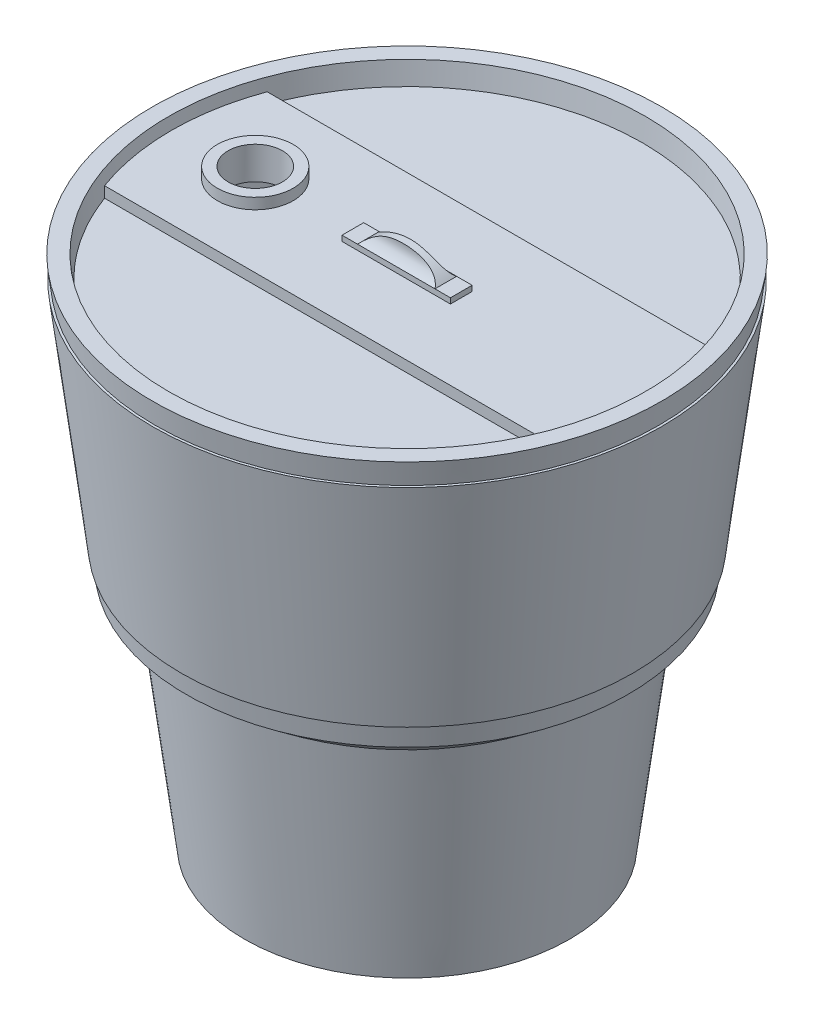
ISO-10303-21;
HEADER;
FILE_DESCRIPTION(('STEP AP214'),'2;1');
FILE_NAME('part.step','',(''),(''),'','','');
FILE_SCHEMA(('AUTOMOTIVE_DESIGN { 1 0 10303 214 1 1 1 1 }'));
ENDSEC;
DATA;
#1=APPLICATION_CONTEXT('core data for automotive mechanical design processes');
#2=APPLICATION_PROTOCOL_DEFINITION('international standard','automotive_design',2000,#1);
#3=PRODUCT_CONTEXT('',#1,'mechanical');
#4=PRODUCT('Part','Part','',(#3));
#5=PRODUCT_RELATED_PRODUCT_CATEGORY('part','',(#4));
#6=PRODUCT_DEFINITION_FORMATION('','',#4);
#7=PRODUCT_DEFINITION_CONTEXT('part definition',#1,'design');
#8=PRODUCT_DEFINITION('design','',#6,#7);
#9=PRODUCT_DEFINITION_SHAPE('','',#8);
#10=(LENGTH_UNIT() NAMED_UNIT(*) SI_UNIT(.MILLI.,.METRE.));
#11=(NAMED_UNIT(*) PLANE_ANGLE_UNIT() SI_UNIT($,.RADIAN.));
#12=(NAMED_UNIT(*) SI_UNIT($,.STERADIAN.) SOLID_ANGLE_UNIT());
#13=UNCERTAINTY_MEASURE_WITH_UNIT(LENGTH_MEASURE(1.E-05),#10,'distance_accuracy_value','');
#14=(GEOMETRIC_REPRESENTATION_CONTEXT(3) GLOBAL_UNCERTAINTY_ASSIGNED_CONTEXT((#13)) GLOBAL_UNIT_ASSIGNED_CONTEXT((#10,
#11,#12)) REPRESENTATION_CONTEXT('',''));
#15=CARTESIAN_POINT('',(0.,0.,0.));
#16=DIRECTION('',(0.,0.,1.));
#17=DIRECTION('',(1.,0.,0.));
#18=AXIS2_PLACEMENT_3D('',#15,#16,#17);
#19=CARTESIAN_POINT('',(0.,46.2361111111111,0.));
#20=DIRECTION('',(0.,1.,0.));
#21=DIRECTION('',(0.,0.,1.));
#22=AXIS2_PLACEMENT_3D('',#19,#20,#21);
#23=PLANE('',#22);
#24=CARTESIAN_POINT('',(-14.,46.2361111111111,0.));
#25=DIRECTION('',(0.,1.,0.));
#26=DIRECTION('',(0.,0.,1.));
#27=AXIS2_PLACEMENT_3D('',#24,#25,#26);
#28=CIRCLE('',#27,3.5);
#29=CARTESIAN_POINT('',(-14.,46.2361111111111,3.5));
#30=VERTEX_POINT('',#29);
#31=EDGE_CURVE('E194',#30,#30,#28,.T.);
#32=ORIENTED_EDGE('',*,*,#31,.F.);
#33=EDGE_LOOP('',(#32));
#34=FACE_BOUND('',#33,.T.);
#35=CARTESIAN_POINT('',(0.,46.2361111111111,0.));
#36=DIRECTION('',(0.,1.,0.));
#37=DIRECTION('',(0.,0.,1.));
#38=AXIS2_PLACEMENT_3D('',#35,#36,#37);
#39=CIRCLE('',#38,21.738326672194);
#40=CARTESIAN_POINT('',(-20.403549850627,46.2361111111111,-7.5));
#41=VERTEX_POINT('',#40);
#42=CARTESIAN_POINT('',(-20.403549850627,46.2361111111111,7.5));
#43=VERTEX_POINT('',#42);
#44=EDGE_CURVE('E203',#41,#43,#39,.T.);
#45=ORIENTED_EDGE('',*,*,#44,.T.);
#46=DIRECTION('',(1.,0.,0.));
#47=VECTOR('',#46,1.);
#48=CARTESIAN_POINT('',(20.403549850627,46.2361111111111,7.5));
#49=LINE('',#48,#47);
#50=CARTESIAN_POINT('',(20.403549850627,46.2361111111111,7.5));
#51=VERTEX_POINT('',#50);
#52=EDGE_CURVE('E207',#43,#51,#49,.T.);
#53=ORIENTED_EDGE('',*,*,#52,.T.);
#54=CARTESIAN_POINT('',(0.,46.2361111111111,0.));
#55=DIRECTION('',(0.,1.,0.));
#56=DIRECTION('',(0.,0.,1.));
#57=AXIS2_PLACEMENT_3D('',#54,#55,#56);
#58=CIRCLE('',#57,21.738326672194);
#59=CARTESIAN_POINT('',(20.403549850627,46.2361111111111,-7.5));
#60=VERTEX_POINT('',#59);
#61=EDGE_CURVE('E211',#51,#60,#58,.T.);
#62=ORIENTED_EDGE('',*,*,#61,.T.);
#63=DIRECTION('',(-1.,0.,0.));
#64=VECTOR('',#63,1.);
#65=CARTESIAN_POINT('',(20.403549850627,46.2361111111111,-7.5));
#66=LINE('',#65,#64);
#67=EDGE_CURVE('E214',#60,#41,#66,.T.);
#68=ORIENTED_EDGE('',*,*,#67,.T.);
#69=EDGE_LOOP('',(#45,#53,#62,#68));
#70=FACE_BOUND('',#69,.T.);
#71=DIRECTION('',(0.,0.,-1.));
#72=VECTOR('',#71,1.);
#73=CARTESIAN_POINT('',(5.,46.2361111111111,1.));
#74=LINE('',#73,#72);
#75=CARTESIAN_POINT('',(5.,46.2361111111111,1.));
#76=VERTEX_POINT('',#75);
#77=CARTESIAN_POINT('',(5.,46.2361111111111,-1.));
#78=VERTEX_POINT('',#77);
#79=EDGE_CURVE('E65',#76,#78,#74,.T.);
#80=ORIENTED_EDGE('',*,*,#79,.F.);
#81=DIRECTION('',(1.,0.,0.));
#82=VECTOR('',#81,1.);
#83=CARTESIAN_POINT('',(-5.,46.2361111111111,1.));
#84=LINE('',#83,#82);
#85=CARTESIAN_POINT('',(-5.,46.2361111111111,1.));
#86=VERTEX_POINT('',#85);
#87=EDGE_CURVE('E70',#86,#76,#84,.T.);
#88=ORIENTED_EDGE('',*,*,#87,.F.);
#89=DIRECTION('',(0.,0.,-1.));
#90=VECTOR('',#89,1.);
#91=CARTESIAN_POINT('',(-5.,46.2361111111111,1.));
#92=LINE('',#91,#90);
#93=CARTESIAN_POINT('',(-5.,46.2361111111111,-1.));
#94=VERTEX_POINT('',#93);
#95=EDGE_CURVE('E172',#86,#94,#92,.T.);
#96=ORIENTED_EDGE('',*,*,#95,.T.);
#97=DIRECTION('',(1.,0.,0.));
#98=VECTOR('',#97,1.);
#99=CARTESIAN_POINT('',(-5.,46.2361111111111,-1.));
#100=LINE('',#99,#98);
#101=EDGE_CURVE('E361',#94,#78,#100,.T.);
#102=ORIENTED_EDGE('',*,*,#101,.T.);
#103=EDGE_LOOP('',(#80,#88,#96,#102));
#104=FACE_BOUND('',#103,.T.);
#105=ADVANCED_FACE('F49',(#34,#70,#104),#23,.T.);
#106=CARTESIAN_POINT('',(0.,45.2361111111111,0.));
#107=DIRECTION('',(0.,1.,0.));
#108=DIRECTION('',(0.,0.,1.));
#109=AXIS2_PLACEMENT_3D('',#106,#107,#108);
#110=PLANE('',#109);
#111=DIRECTION('',(-1.,0.,0.));
#112=VECTOR('',#111,1.);
#113=CARTESIAN_POINT('',(20.403549850627,45.2361111111111,-7.5));
#114=LINE('',#113,#112);
#115=CARTESIAN_POINT('',(20.403549850627,45.2361111111111,-7.5));
#116=VERTEX_POINT('',#115);
#117=CARTESIAN_POINT('',(-20.403549850627,45.2361111111111,-7.5));
#118=VERTEX_POINT('',#117);
#119=EDGE_CURVE('E208',#116,#118,#114,.T.);
#120=ORIENTED_EDGE('',*,*,#119,.F.);
#121=CARTESIAN_POINT('',(0.,45.2361111111111,0.));
#122=DIRECTION('',(0.,-1.,0.));
#123=DIRECTION('',(0.,0.,-1.));
#124=AXIS2_PLACEMENT_3D('',#121,#122,#123);
#125=CIRCLE('',#124,21.738326672194);
#126=EDGE_CURVE('E243',#118,#116,#125,.T.);
#127=ORIENTED_EDGE('',*,*,#126,.F.);
#128=EDGE_LOOP('',(#120,#127));
#129=FACE_BOUND('',#128,.T.);
#130=ADVANCED_FACE('F256',(#129),#110,.T.);
#131=CARTESIAN_POINT('',(0.,44.2361111111111,0.));
#132=DIRECTION('',(0.,1.,0.));
#133=DIRECTION('',(0.,0.,1.));
#134=AXIS2_PLACEMENT_3D('',#131,#132,#133);
#135=CONICAL_SURFACE('',#134,21.613326672194,0.124354994546761);
#136=CARTESIAN_POINT('',(20.403549850627,45.2361111111111,7.5));
#137=VERTEX_POINT('',#136);
#138=EDGE_CURVE('E244',#116,#137,#125,.T.);
#139=ORIENTED_EDGE('',*,*,#138,.T.);
#140=CARTESIAN_POINT('',(-20.403549850627,45.2361111111111,7.5));
#141=VERTEX_POINT('',#140);
#142=EDGE_CURVE('E247',#137,#141,#125,.T.);
#143=ORIENTED_EDGE('',*,*,#142,.T.);
#144=CARTESIAN_POINT('',(0.,45.2361111111111,0.));
#145=DIRECTION('',(0.,1.,0.));
#146=DIRECTION('',(0.,0.,1.));
#147=AXIS2_PLACEMENT_3D('',#144,#145,#146);
#148=CIRCLE('',#147,21.738326672194);
#149=EDGE_CURVE('E199',#118,#141,#148,.T.);
#150=ORIENTED_EDGE('',*,*,#149,.F.);
#151=ORIENTED_EDGE('',*,*,#126,.T.);
#152=EDGE_LOOP('',(#139,#143,#150,#151));
#153=FACE_BOUND('',#152,.T.);
#154=CARTESIAN_POINT('',(0.,44.2361111111111,0.));
#155=DIRECTION('',(0.,-1.,0.));
#156=DIRECTION('',(0.,0.,-1.));
#157=AXIS2_PLACEMENT_3D('',#154,#155,#156);
#158=CIRCLE('',#157,21.613326672194);
#159=CARTESIAN_POINT('',(0.,44.2361111111111,-21.613326672194));
#160=VERTEX_POINT('',#159);
#161=EDGE_CURVE('E133',#160,#160,#158,.T.);
#162=ORIENTED_EDGE('',*,*,#161,.F.);
#163=EDGE_LOOP('',(#162));
#164=FACE_BOUND('',#163,.T.);
#165=ADVANCED_FACE('F51',(#153,#164),#135,.T.);
#166=CARTESIAN_POINT('',(21.613326672194,44.2361111111111,0.));
#167=DIRECTION('',(0.,-1.,0.));
#168=DIRECTION('',(0.,0.,-1.));
#169=AXIS2_PLACEMENT_3D('',#166,#167,#168);
#170=PLANE('',#169);
#171=CARTESIAN_POINT('',(-14.,44.2361111111111,0.));
#172=DIRECTION('',(0.,-1.,0.));
#173=DIRECTION('',(0.,0.,-1.));
#174=AXIS2_PLACEMENT_3D('',#171,#172,#173);
#175=CIRCLE('',#174,2.5);
#176=CARTESIAN_POINT('',(-14.,44.2361111111111,-2.5));
#177=VERTEX_POINT('',#176);
#178=EDGE_CURVE('E190',#177,#177,#175,.T.);
#179=ORIENTED_EDGE('',*,*,#178,.F.);
#180=EDGE_LOOP('',(#179));
#181=FACE_BOUND('',#180,.T.);
#182=ORIENTED_EDGE('',*,*,#161,.T.);
#183=EDGE_LOOP('',(#182));
#184=FACE_BOUND('',#183,.T.);
#185=ADVANCED_FACE('F253',(#181,#184),#170,.T.);
#186=DIRECTION('',(1.,0.,0.));
#187=VECTOR('',#186,1.);
#188=CARTESIAN_POINT('',(20.403549850627,45.2361111111111,7.5));
#189=LINE('',#188,#187);
#190=EDGE_CURVE('E221',#141,#137,#189,.T.);
#191=ORIENTED_EDGE('',*,*,#190,.F.);
#192=ORIENTED_EDGE('',*,*,#142,.F.);
#193=EDGE_LOOP('',(#191,#192));
#194=FACE_BOUND('',#193,.T.);
#195=ADVANCED_FACE('F262',(#194),#110,.T.);
#196=CARTESIAN_POINT('',(0.,46.2361111111111,0.));
#197=DIRECTION('',(0.,-1.,0.));
#198=DIRECTION('',(0.,0.,-1.));
#199=AXIS2_PLACEMENT_3D('',#196,#197,#198);
#200=CYLINDRICAL_SURFACE('',#199,21.738326672194);
#201=ORIENTED_EDGE('',*,*,#149,.T.);
#202=DIRECTION('',(0.,-1.,0.));
#203=VECTOR('',#202,1.);
#204=CARTESIAN_POINT('',(-20.403549850627,46.2361111111111,7.5));
#205=LINE('',#204,#203);
#206=EDGE_CURVE('E239',#43,#141,#205,.T.);
#207=ORIENTED_EDGE('',*,*,#206,.F.);
#208=ORIENTED_EDGE('',*,*,#44,.F.);
#209=DIRECTION('',(0.,-1.,0.));
#210=VECTOR('',#209,1.);
#211=CARTESIAN_POINT('',(-20.403549850627,46.2361111111111,-7.5));
#212=LINE('',#211,#210);
#213=EDGE_CURVE('E217',#41,#118,#212,.T.);
#214=ORIENTED_EDGE('',*,*,#213,.T.);
#215=EDGE_LOOP('',(#201,#207,#208,#214));
#216=FACE_BOUND('',#215,.T.);
#217=ADVANCED_FACE('F288',(#216),#200,.T.);
#218=CARTESIAN_POINT('',(20.403549850627,46.2361111111111,7.5));
#219=DIRECTION('',(0.,0.,-1.));
#220=DIRECTION('',(-1.,0.,0.));
#221=AXIS2_PLACEMENT_3D('',#218,#219,#220);
#222=PLANE('',#221);
#223=ORIENTED_EDGE('',*,*,#190,.T.);
#224=DIRECTION('',(0.,-1.,0.));
#225=VECTOR('',#224,1.);
#226=CARTESIAN_POINT('',(20.403549850627,46.2361111111111,7.5));
#227=LINE('',#226,#225);
#228=EDGE_CURVE('E235',#51,#137,#227,.T.);
#229=ORIENTED_EDGE('',*,*,#228,.F.);
#230=ORIENTED_EDGE('',*,*,#52,.F.);
#231=ORIENTED_EDGE('',*,*,#206,.T.);
#232=EDGE_LOOP('',(#223,#229,#230,#231));
#233=FACE_BOUND('',#232,.T.);
#234=ADVANCED_FACE('F284',(#233),#222,.F.);
#235=CARTESIAN_POINT('',(0.,46.2361111111111,0.));
#236=DIRECTION('',(0.,-1.,0.));
#237=DIRECTION('',(0.,0.,-1.));
#238=AXIS2_PLACEMENT_3D('',#235,#236,#237);
#239=CYLINDRICAL_SURFACE('',#238,21.738326672194);
#240=ORIENTED_EDGE('',*,*,#138,.F.);
#241=DIRECTION('',(0.,-1.,0.));
#242=VECTOR('',#241,1.);
#243=CARTESIAN_POINT('',(20.403549850627,46.2361111111111,-7.5));
#244=LINE('',#243,#242);
#245=EDGE_CURVE('E231',#60,#116,#244,.T.);
#246=ORIENTED_EDGE('',*,*,#245,.F.);
#247=ORIENTED_EDGE('',*,*,#61,.F.);
#248=ORIENTED_EDGE('',*,*,#228,.T.);
#249=EDGE_LOOP('',(#240,#246,#247,#248));
#250=FACE_BOUND('',#249,.T.);
#251=ADVANCED_FACE('F280',(#250),#239,.T.);
#252=CARTESIAN_POINT('',(20.403549850627,46.2361111111111,-7.5));
#253=DIRECTION('',(0.,0.,1.));
#254=DIRECTION('',(1.,0.,0.));
#255=AXIS2_PLACEMENT_3D('',#252,#253,#254);
#256=PLANE('',#255);
#257=ORIENTED_EDGE('',*,*,#119,.T.);
#258=ORIENTED_EDGE('',*,*,#213,.F.);
#259=ORIENTED_EDGE('',*,*,#67,.F.);
#260=ORIENTED_EDGE('',*,*,#245,.T.);
#261=EDGE_LOOP('',(#257,#258,#259,#260));
#262=FACE_BOUND('',#261,.T.);
#263=ADVANCED_FACE('F277',(#262),#256,.F.);
#264=CARTESIAN_POINT('',(-14.,47.2361111111111,0.));
#265=DIRECTION('',(0.,-1.,0.));
#266=DIRECTION('',(0.,0.,-1.));
#267=AXIS2_PLACEMENT_3D('',#264,#265,#266);
#268=CYLINDRICAL_SURFACE('',#267,3.5);
#269=CARTESIAN_POINT('',(-14.,47.2361111111111,0.));
#270=DIRECTION('',(0.,1.,0.));
#271=DIRECTION('',(0.,0.,1.));
#272=AXIS2_PLACEMENT_3D('',#269,#270,#271);
#273=CIRCLE('',#272,3.5);
#274=CARTESIAN_POINT('',(-14.,47.2361111111111,3.5));
#275=VERTEX_POINT('',#274);
#276=EDGE_CURVE('E195',#275,#275,#273,.T.);
#277=ORIENTED_EDGE('',*,*,#276,.F.);
#278=EDGE_LOOP('',(#277));
#279=FACE_BOUND('',#278,.T.);
#280=ORIENTED_EDGE('',*,*,#31,.T.);
#281=EDGE_LOOP('',(#280));
#282=FACE_BOUND('',#281,.T.);
#283=ADVANCED_FACE('F275',(#279,#282),#268,.T.);
#284=CARTESIAN_POINT('',(-14.,47.2361111111111,0.));
#285=DIRECTION('',(0.,1.,0.));
#286=DIRECTION('',(0.,0.,1.));
#287=AXIS2_PLACEMENT_3D('',#284,#285,#286);
#288=PLANE('',#287);
#289=CARTESIAN_POINT('',(-14.,47.2361111111111,0.));
#290=DIRECTION('',(0.,1.,0.));
#291=DIRECTION('',(0.,0.,1.));
#292=AXIS2_PLACEMENT_3D('',#289,#290,#291);
#293=CIRCLE('',#292,2.5);
#294=CARTESIAN_POINT('',(-14.,47.2361111111111,2.5));
#295=VERTEX_POINT('',#294);
#296=EDGE_CURVE('E186',#295,#295,#293,.T.);
#297=ORIENTED_EDGE('',*,*,#296,.F.);
#298=EDGE_LOOP('',(#297));
#299=FACE_BOUND('',#298,.T.);
#300=ORIENTED_EDGE('',*,*,#276,.T.);
#301=EDGE_LOOP('',(#300));
#302=FACE_BOUND('',#301,.T.);
#303=ADVANCED_FACE('F404',(#299,#302),#288,.T.);
#304=CARTESIAN_POINT('',(-14.,28.2361111111111,0.));
#305=DIRECTION('',(0.,1.,0.));
#306=DIRECTION('',(0.,0.,1.));
#307=AXIS2_PLACEMENT_3D('',#304,#305,#306);
#308=CYLINDRICAL_SURFACE('',#307,2.5);
#309=ORIENTED_EDGE('',*,*,#178,.T.);
#310=EDGE_LOOP('',(#309));
#311=FACE_BOUND('',#310,.T.);
#312=ORIENTED_EDGE('',*,*,#296,.T.);
#313=EDGE_LOOP('',(#312));
#314=FACE_BOUND('',#313,.T.);
#315=ADVANCED_FACE('F402',(#311,#314),#308,.F.);
#316=CARTESIAN_POINT('',(5.,46.2361111111111,1.));
#317=DIRECTION('',(-1.,0.,0.));
#318=DIRECTION('',(0.,0.,1.));
#319=AXIS2_PLACEMENT_3D('',#316,#317,#318);
#320=PLANE('',#319);
#321=DIRECTION('',(0.,1.,0.));
#322=VECTOR('',#321,1.);
#323=CARTESIAN_POINT('',(5.,46.2361111111111,-1.));
#324=LINE('',#323,#322);
#325=CARTESIAN_POINT('',(5.,46.7361111111111,-1.));
#326=VERTEX_POINT('',#325);
#327=EDGE_CURVE('E168',#78,#326,#324,.T.);
#328=ORIENTED_EDGE('',*,*,#327,.T.);
#329=DIRECTION('',(0.,0.,-1.));
#330=VECTOR('',#329,1.);
#331=CARTESIAN_POINT('',(5.,46.7361111111111,1.));
#332=LINE('',#331,#330);
#333=CARTESIAN_POINT('',(5.,46.7361111111111,1.));
#334=VERTEX_POINT('',#333);
#335=EDGE_CURVE('E180',#334,#326,#332,.T.);
#336=ORIENTED_EDGE('',*,*,#335,.F.);
#337=DIRECTION('',(0.,1.,0.));
#338=VECTOR('',#337,1.);
#339=CARTESIAN_POINT('',(5.,46.2361111111111,1.));
#340=LINE('',#339,#338);
#341=EDGE_CURVE('E344',#76,#334,#340,.T.);
#342=ORIENTED_EDGE('',*,*,#341,.F.);
#343=ORIENTED_EDGE('',*,*,#79,.T.);
#344=EDGE_LOOP('',(#328,#336,#342,#343));
#345=FACE_BOUND('',#344,.T.);
#346=ADVANCED_FACE('F368',(#345),#320,.F.);
#347=CARTESIAN_POINT('',(5.,46.7361111111111,1.));
#348=DIRECTION('',(0.,-1.,0.));
#349=DIRECTION('',(0.,0.,-1.));
#350=AXIS2_PLACEMENT_3D('',#347,#348,#349);
#351=PLANE('',#350);
#352=DIRECTION('',(-1.,0.,0.));
#353=VECTOR('',#352,1.);
#354=CARTESIAN_POINT('',(5.,46.7361111111111,-1.));
#355=LINE('',#354,#353);
#356=CARTESIAN_POINT('',(3.57071421427143,46.7361111111111,-1.));
#357=VERTEX_POINT('',#356);
#358=EDGE_CURVE('E162',#326,#357,#355,.T.);
#359=ORIENTED_EDGE('',*,*,#358,.T.);
#360=DIRECTION('',(0.,0.,-1.));
#361=VECTOR('',#360,1.);
#362=CARTESIAN_POINT('',(3.57071421427143,46.7361111111111,1.));
#363=LINE('',#362,#361);
#364=CARTESIAN_POINT('',(3.57071421427143,46.7361111111111,1.));
#365=VERTEX_POINT('',#364);
#366=EDGE_CURVE('E143',#365,#357,#363,.T.);
#367=ORIENTED_EDGE('',*,*,#366,.F.);
#368=DIRECTION('',(-1.,0.,0.));
#369=VECTOR('',#368,1.);
#370=CARTESIAN_POINT('',(5.,46.7361111111111,1.));
#371=LINE('',#370,#369);
#372=EDGE_CURVE('E339',#334,#365,#371,.T.);
#373=ORIENTED_EDGE('',*,*,#372,.F.);
#374=ORIENTED_EDGE('',*,*,#335,.T.);
#375=EDGE_LOOP('',(#359,#367,#373,#374));
#376=FACE_BOUND('',#375,.T.);
#377=ADVANCED_FACE('F371',(#376),#351,.F.);
#378=CARTESIAN_POINT('',(0.,43.2361111111111,1.));
#379=DIRECTION('',(0.,0.,-1.));
#380=DIRECTION('',(-1.,0.,0.));
#381=AXIS2_PLACEMENT_3D('',#378,#379,#380);
#382=CYLINDRICAL_SURFACE('',#381,5.);
#383=DIRECTION('',(0.,0.,-1.));
#384=VECTOR('',#383,1.);
#385=CARTESIAN_POINT('',(-3.57071421427143,46.7361111111111,1.));
#386=LINE('',#385,#384);
#387=CARTESIAN_POINT('',(-3.57071421427143,46.7361111111111,1.));
#388=VERTEX_POINT('',#387);
#389=CARTESIAN_POINT('',(-3.57071421427143,46.7361111111111,-1.));
#390=VERTEX_POINT('',#389);
#391=EDGE_CURVE('E140',#388,#390,#386,.T.);
#392=ORIENTED_EDGE('',*,*,#391,.F.);
#393=CARTESIAN_POINT('',(-3.57071421427143,46.7361111111111,0.999999999999989));
#394=CARTESIAN_POINT('',(-3.5479029656164,46.7593885166791,0.96407107302135));
#395=CARTESIAN_POINT('',(-3.52358409430791,46.7837378656328,0.9298648952637));
#396=CARTESIAN_POINT('',(-3.47223790019597,46.8340056570424,0.864941003164755));
#397=CARTESIAN_POINT('',(-3.4452159071971,46.8599209733818,0.834216669242431));
#398=CARTESIAN_POINT('',(-3.36114245996246,46.9386158963845,0.747882593246908));
#399=CARTESIAN_POINT('',(-3.30048109504097,46.992972251144,0.697187574652451));
#400=CARTESIAN_POINT('',(-3.15090639139968,47.1199510796742,0.59374586333563));
#401=CARTESIAN_POINT('',(-3.05916372941883,47.192853270116,0.545532610265804));
#402=CARTESIAN_POINT('',(-2.86561029128815,47.335239728843,0.466043391558294));
#403=CARTESIAN_POINT('',(-2.76374468659822,47.4047019478538,0.434866351398645));
#404=CARTESIAN_POINT('',(-2.57433889131468,47.5236115813287,0.390532320012376));
#405=CARTESIAN_POINT('',(-2.48807210538145,47.5742644598229,0.375005288803181));
#406=CARTESIAN_POINT('',(-2.31191525935066,47.6706495556108,0.350293872962854));
#407=CARTESIAN_POINT('',(-2.22202310129728,47.7163788658653,0.341113218294127));
#408=CARTESIAN_POINT('',(-2.03925759912479,47.8024718344393,0.32742381543747));
#409=CARTESIAN_POINT('',(-1.94638086632206,47.8428291054237,0.32292058618719));
#410=CARTESIAN_POINT('',(-1.75825401970194,47.9178634087154,0.317171835198704));
#411=CARTESIAN_POINT('',(-1.66300330267262,47.9525389800374,0.315927150130083));
#412=CARTESIAN_POINT('',(-1.43382916760862,48.0281595015153,0.315383963849791));
#413=CARTESIAN_POINT('',(-1.29902052224393,48.0664462509429,0.317009546134197));
#414=CARTESIAN_POINT('',(-1.02666572714705,48.1315758599938,0.321539387256023));
#415=CARTESIAN_POINT('',(-0.88911877645344,48.1584153182074,0.324444025627532));
#416=CARTESIAN_POINT('',(-0.612317682933977,48.2004488297883,0.329651679338773));
#417=CARTESIAN_POINT('',(-0.47306452846128,48.2156493286796,0.331955027199889));
#418=CARTESIAN_POINT('',(-0.193776070824706,48.2343143020831,0.334850900690668));
#419=CARTESIAN_POINT('',(-0.0537408942629422,48.2377806240648,0.335443695633527));
#420=CARTESIAN_POINT('',(0.226241188419716,48.2329536706515,0.334660112939231));
#421=CARTESIAN_POINT('',(0.366187913876207,48.2246502372568,0.333282034311646));
#422=CARTESIAN_POINT('',(0.644896177262685,48.1963261261353,0.329170440409703));
#423=CARTESIAN_POINT('',(0.783657474251393,48.1763031212827,0.32643665595274));
#424=CARTESIAN_POINT('',(1.05901940771682,48.1246800558933,0.321056222399034));
#425=CARTESIAN_POINT('',(1.195619844521,48.0930789319334,0.31840958133055));
#426=CARTESIAN_POINT('',(1.46568103427452,48.0185145169837,0.315381237468604));
#427=CARTESIAN_POINT('',(1.59914310351435,47.9755560854795,0.314998567616115));
#428=CARTESIAN_POINT('',(1.81437206510242,47.8961593124707,0.318600528080365));
#429=CARTESIAN_POINT('',(1.89737813654367,47.8629819724435,0.321055702696149));
#430=CARTESIAN_POINT('',(2.06136515117978,47.7922872160161,0.328989879649613));
#431=CARTESIAN_POINT('',(2.14234659989595,47.7547708964329,0.334468119124813));
#432=CARTESIAN_POINT('',(2.3018234267725,47.6756516355577,0.349488253317237));
#433=CARTESIAN_POINT('',(2.38032113799756,47.6340526896084,0.359026205032462));
#434=CARTESIAN_POINT('',(2.53435478399747,47.5471281718094,0.383361037560958));
#435=CARTESIAN_POINT('',(2.60989189289361,47.5018040998213,0.398155809696959));
#436=CARTESIAN_POINT('',(2.78151399152209,47.3926232381928,0.440286804453282));
#437=CARTESIAN_POINT('',(2.87624761930135,47.3275501716838,0.470141435666589));
#438=CARTESIAN_POINT('',(3.05682530983602,47.1944326807685,0.544853430355287));
#439=CARTESIAN_POINT('',(3.14270931237858,47.1264037719686,0.589639140769908));
#440=CARTESIAN_POINT('',(3.29005872825286,47.0021743088208,0.688892436032709));
#441=CARTESIAN_POINT('',(3.35322412488649,46.9458485145188,0.740602964003618));
#442=CARTESIAN_POINT('',(3.44062334687772,46.864298341045,0.829128951192221));
#443=CARTESIAN_POINT('',(3.46868754041288,46.8374419937708,0.86070309673379));
#444=CARTESIAN_POINT('',(3.52194634743786,46.7853772581334,0.927565282079745));
#445=CARTESIAN_POINT('',(3.54713492419542,46.7601723822468,0.962860846086281));
#446=CARTESIAN_POINT('',(3.57071421427146,46.7361111111111,0.999999999999912));
#447=B_SPLINE_CURVE_WITH_KNOTS('',3,(#393,#394,#395,#396,#397,#398,#399,#400,#401,#402,#403,
#404,#405,#406,#407,#408,#409,#410,#411,#412,#413,#414,#415,#416,#417,#418,#419,#420,#421,#422,
#423,#424,#425,#426,#427,#428,#429,#430,#431,#432,#433,#434,#435,#436,#437,#438,#439,#440,#441,
#442,#443,#444,#445,#446),.UNSPECIFIED.,.F.,.F.,(4,2,2,2,2,2,2,2,2,2,2,2,2,2,2,2,2,2,2,2,2,2,2,
2,2,2,4),(0.,0.145376013780474,0.290470834135065,0.576911546308798,0.955002027763317,
1.33526527631529,1.63856512904924,1.94204308930564,2.2458787206582,2.54979235773869,
2.96969732903144,3.38972698270222,3.809523860133,4.22925464021742,4.64934789360005,
5.06952459215031,5.48973989262297,5.90977568447248,6.1778982147056,6.44595311584218,
6.71374826018597,6.98143610445815,7.33659671200826,7.69007689399672,7.98610007330244,
8.13604947775524,8.28630809463876),.UNSPECIFIED.);
#448=EDGE_CURVE('E145',#388,#365,#447,.T.);
#449=ORIENTED_EDGE('',*,*,#448,.T.);
#450=ORIENTED_EDGE('',*,*,#366,.T.);
#451=CARTESIAN_POINT('',(3.57071421427144,46.7361111111111,-1.));
#452=CARTESIAN_POINT('',(3.54790296561641,46.7593885166791,-0.964071073021363));
#453=CARTESIAN_POINT('',(3.52358409430792,46.7837378656328,-0.929864895263713));
#454=CARTESIAN_POINT('',(3.47223790019598,46.8340056570424,-0.864941003164767));
#455=CARTESIAN_POINT('',(3.44521590719711,46.8599209733818,-0.834216669242443));
#456=CARTESIAN_POINT('',(3.36114245996247,46.9386158963844,-0.747882593246917));
#457=CARTESIAN_POINT('',(3.30048109504099,46.992972251144,-0.697187574652462));
#458=CARTESIAN_POINT('',(3.1509063913997,47.1199510796742,-0.593745863335641));
#459=CARTESIAN_POINT('',(3.05916372941885,47.192853270116,-0.545532610265812));
#460=CARTESIAN_POINT('',(2.86561029128817,47.335239728843,-0.466043391558299));
#461=CARTESIAN_POINT('',(2.76374468659823,47.4047019478538,-0.434866351398649));
#462=CARTESIAN_POINT('',(2.5743388913147,47.5236115813287,-0.390532320012379));
#463=CARTESIAN_POINT('',(2.48807210538146,47.5742644598229,-0.375005288803183));
#464=CARTESIAN_POINT('',(2.31191525935068,47.6706495556108,-0.350293872962856));
#465=CARTESIAN_POINT('',(2.22202310129729,47.7163788658653,-0.341113218294129));
#466=CARTESIAN_POINT('',(2.03925759912481,47.8024718344393,-0.327423815437471));
#467=CARTESIAN_POINT('',(1.94638086632208,47.8428291054237,-0.322920586187191));
#468=CARTESIAN_POINT('',(1.75825401970196,47.9178634087154,-0.317171835198705));
#469=CARTESIAN_POINT('',(1.66300330267264,47.9525389800374,-0.315927150130083));
#470=CARTESIAN_POINT('',(1.43382916760864,48.0281595015153,-0.31538396384979));
#471=CARTESIAN_POINT('',(1.29902052224395,48.0664462509429,-0.317009546134196));
#472=CARTESIAN_POINT('',(1.02666572714707,48.1315758599938,-0.321539387256022));
#473=CARTESIAN_POINT('',(0.889118776453458,48.1584153182074,-0.324444025627532));
#474=CARTESIAN_POINT('',(0.612317682933996,48.2004488297883,-0.329651679338772));
#475=CARTESIAN_POINT('',(0.473064528461298,48.2156493286796,-0.331955027199889));
#476=CARTESIAN_POINT('',(0.193776070824724,48.2343143020831,-0.334850900690668));
#477=CARTESIAN_POINT('',(0.0537408942629609,48.2377806240648,-0.335443695633527));
#478=CARTESIAN_POINT('',(-0.226241188419697,48.2329536706515,-0.334660112939232));
#479=CARTESIAN_POINT('',(-0.366187913876189,48.2246502372568,-0.333282034311647));
#480=CARTESIAN_POINT('',(-0.644896177262667,48.1963261261353,-0.329170440409704));
#481=CARTESIAN_POINT('',(-0.783657474251375,48.1763031212827,-0.32643665595274));
#482=CARTESIAN_POINT('',(-1.0590194077168,48.1246800558933,-0.321056222399034));
#483=CARTESIAN_POINT('',(-1.19561984452098,48.0930789319334,-0.31840958133055));
#484=CARTESIAN_POINT('',(-1.4656810342745,48.0185145169837,-0.315381237468604));
#485=CARTESIAN_POINT('',(-1.59914310351433,47.9755560854796,-0.314998567616115));
#486=CARTESIAN_POINT('',(-1.8143720651024,47.8961593124707,-0.318600528080364));
#487=CARTESIAN_POINT('',(-1.89737813654365,47.8629819724436,-0.321055702696149));
#488=CARTESIAN_POINT('',(-2.06136515117976,47.7922872160161,-0.328989879649611));
#489=CARTESIAN_POINT('',(-2.14234659989594,47.7547708964329,-0.334468119124811));
#490=CARTESIAN_POINT('',(-2.30182342677249,47.6756516355577,-0.349488253317235));
#491=CARTESIAN_POINT('',(-2.38032113799755,47.6340526896084,-0.359026205032461));
#492=CARTESIAN_POINT('',(-2.53435478399746,47.5471281718094,-0.383361037560957));
#493=CARTESIAN_POINT('',(-2.6098918928936,47.5018040998213,-0.398155809696958));
#494=CARTESIAN_POINT('',(-2.78151399152209,47.3926232381928,-0.440286804453281));
#495=CARTESIAN_POINT('',(-2.87624761930135,47.3275501716838,-0.470141435666589));
#496=CARTESIAN_POINT('',(-3.05682530983602,47.1944326807686,-0.544853430355287));
#497=CARTESIAN_POINT('',(-3.14270931237858,47.1264037719686,-0.589639140769907));
#498=CARTESIAN_POINT('',(-3.29005872825285,47.0021743088208,-0.688892436032708));
#499=CARTESIAN_POINT('',(-3.35322412488649,46.9458485145188,-0.740602964003616));
#500=CARTESIAN_POINT('',(-3.44062334687772,46.864298341045,-0.829128951192218));
#501=CARTESIAN_POINT('',(-3.46868754041287,46.8374419937708,-0.860703096733788));
#502=CARTESIAN_POINT('',(-3.52194634743786,46.7853772581334,-0.927565282079744));
#503=CARTESIAN_POINT('',(-3.54713492419542,46.7601723822468,-0.96286084608628));
#504=CARTESIAN_POINT('',(-3.57071421427146,46.7361111111111,-0.999999999999912));
#505=B_SPLINE_CURVE_WITH_KNOTS('',3,(#451,#452,#453,#454,#455,#456,#457,#458,#459,#460,#461,
#462,#463,#464,#465,#466,#467,#468,#469,#470,#471,#472,#473,#474,#475,#476,#477,#478,#479,#480,
#481,#482,#483,#484,#485,#486,#487,#488,#489,#490,#491,#492,#493,#494,#495,#496,#497,#498,#499,
#500,#501,#502,#503,#504),.UNSPECIFIED.,.F.,.F.,(4,2,2,2,2,2,2,2,2,2,2,2,2,2,2,2,2,2,2,2,2,2,2,
2,2,2,4),(0.,0.145376013780473,0.290470834135059,0.576911546308793,0.955002027763309,
1.33526527631529,1.63856512904924,1.94204308930563,2.24587872065819,2.54979235773869,
2.96969732903144,3.38972698270222,3.80952386013299,4.22925464021742,4.64934789360004,
5.0695245921503,5.48973989262296,5.90977568447247,6.1778982147056,6.44595311584218,
6.71374826018598,6.98143610445816,7.33659671200827,7.69007689399674,7.98610007330245,
8.13604947775525,8.28630809463877),.UNSPECIFIED.);
#506=EDGE_CURVE('E127',#357,#390,#505,.T.);
#507=ORIENTED_EDGE('',*,*,#506,.T.);
#508=EDGE_LOOP('',(#392,#449,#450,#507));
#509=FACE_BOUND('',#508,.T.);
#510=ADVANCED_FACE('F138',(#509),#382,.T.);
#511=CARTESIAN_POINT('',(-5.,46.7361111111111,1.));
#512=DIRECTION('',(0.,-1.,0.));
#513=DIRECTION('',(0.,0.,-1.));
#514=AXIS2_PLACEMENT_3D('',#511,#512,#513);
#515=PLANE('',#514);
#516=DIRECTION('',(-1.,0.,0.));
#517=VECTOR('',#516,1.);
#518=CARTESIAN_POINT('',(-5.,46.7361111111111,-1.));
#519=LINE('',#518,#517);
#520=CARTESIAN_POINT('',(-5.,46.7361111111111,-1.));
#521=VERTEX_POINT('',#520);
#522=EDGE_CURVE('E150',#390,#521,#519,.T.);
#523=ORIENTED_EDGE('',*,*,#522,.T.);
#524=DIRECTION('',(0.,0.,-1.));
#525=VECTOR('',#524,1.);
#526=CARTESIAN_POINT('',(-5.,46.7361111111111,1.));
#527=LINE('',#526,#525);
#528=CARTESIAN_POINT('',(-5.,46.7361111111111,1.));
#529=VERTEX_POINT('',#528);
#530=EDGE_CURVE('E154',#529,#521,#527,.T.);
#531=ORIENTED_EDGE('',*,*,#530,.F.);
#532=DIRECTION('',(-1.,0.,0.));
#533=VECTOR('',#532,1.);
#534=CARTESIAN_POINT('',(-5.,46.7361111111111,1.));
#535=LINE('',#534,#533);
#536=EDGE_CURVE('E152',#388,#529,#535,.T.);
#537=ORIENTED_EDGE('',*,*,#536,.F.);
#538=ORIENTED_EDGE('',*,*,#391,.T.);
#539=EDGE_LOOP('',(#523,#531,#537,#538));
#540=FACE_BOUND('',#539,.T.);
#541=ADVANCED_FACE('F148',(#540),#515,.F.);
#542=CARTESIAN_POINT('',(-5.,46.2361111111111,1.));
#543=DIRECTION('',(1.,0.,0.));
#544=DIRECTION('',(0.,0.,-1.));
#545=AXIS2_PLACEMENT_3D('',#542,#543,#544);
#546=PLANE('',#545);
#547=DIRECTION('',(0.,-1.,0.));
#548=VECTOR('',#547,1.);
#549=CARTESIAN_POINT('',(-5.,46.2361111111111,-1.));
#550=LINE('',#549,#548);
#551=EDGE_CURVE('E160',#521,#94,#550,.T.);
#552=ORIENTED_EDGE('',*,*,#551,.T.);
#553=ORIENTED_EDGE('',*,*,#95,.F.);
#554=DIRECTION('',(0.,-1.,0.));
#555=VECTOR('',#554,1.);
#556=CARTESIAN_POINT('',(-5.,46.2361111111111,1.));
#557=LINE('',#556,#555);
#558=EDGE_CURVE('E175',#529,#86,#557,.T.);
#559=ORIENTED_EDGE('',*,*,#558,.F.);
#560=ORIENTED_EDGE('',*,*,#530,.T.);
#561=EDGE_LOOP('',(#552,#553,#559,#560));
#562=FACE_BOUND('',#561,.T.);
#563=ADVANCED_FACE('F480',(#562),#546,.F.);
#564=CARTESIAN_POINT('',(0.,43.2361111111111,1.));
#565=DIRECTION('',(0.,0.,-1.));
#566=DIRECTION('',(-1.,0.,0.));
#567=AXIS2_PLACEMENT_3D('',#564,#565,#566);
#568=PLANE('',#567);
#569=ORIENTED_EDGE('',*,*,#372,.T.);
#570=DIRECTION('',(-1.,0.,0.));
#571=VECTOR('',#570,1.);
#572=CARTESIAN_POINT('',(0.,46.7361111111111,1.));
#573=LINE('',#572,#571);
#574=EDGE_CURVE('E12',#365,#388,#573,.T.);
#575=ORIENTED_EDGE('',*,*,#574,.T.);
#576=ORIENTED_EDGE('',*,*,#536,.T.);
#577=ORIENTED_EDGE('',*,*,#558,.T.);
#578=ORIENTED_EDGE('',*,*,#87,.T.);
#579=ORIENTED_EDGE('',*,*,#341,.T.);
#580=EDGE_LOOP('',(#569,#575,#576,#577,#578,#579));
#581=FACE_BOUND('',#580,.T.);
#582=ADVANCED_FACE('F372',(#581),#568,.F.);
#583=CARTESIAN_POINT('',(0.,43.2361111111111,-1.));
#584=DIRECTION('',(0.,0.,-1.));
#585=DIRECTION('',(-1.,0.,0.));
#586=AXIS2_PLACEMENT_3D('',#583,#584,#585);
#587=PLANE('',#586);
#588=DIRECTION('',(-1.,0.,0.));
#589=VECTOR('',#588,1.);
#590=CARTESIAN_POINT('',(0.,46.7361111111111,-1.));
#591=LINE('',#590,#589);
#592=EDGE_CURVE('E58',#357,#390,#591,.T.);
#593=ORIENTED_EDGE('',*,*,#592,.F.);
#594=ORIENTED_EDGE('',*,*,#358,.F.);
#595=ORIENTED_EDGE('',*,*,#327,.F.);
#596=ORIENTED_EDGE('',*,*,#101,.F.);
#597=ORIENTED_EDGE('',*,*,#551,.F.);
#598=ORIENTED_EDGE('',*,*,#522,.F.);
#599=EDGE_LOOP('',(#593,#594,#595,#596,#597,#598));
#600=FACE_BOUND('',#599,.T.);
#601=ADVANCED_FACE('F157',(#600),#587,.T.);
#602=CARTESIAN_POINT('',(-7.5,47.9949585614182,-1.81566114094965));
#603=DIRECTION('',(1.,0.,0.));
#604=DIRECTION('',(0.,0.,-1.));
#605=AXIS2_PLACEMENT_3D('',#602,#603,#604);
#606=CYLINDRICAL_SURFACE('',#605,1.5);
#607=ORIENTED_EDGE('',*,*,#592,.T.);
#608=ORIENTED_EDGE('',*,*,#506,.F.);
#609=EDGE_LOOP('',(#607,#608));
#610=FACE_BOUND('',#609,.T.);
#611=ADVANCED_FACE('F126',(#610),#606,.F.);
#612=CARTESIAN_POINT('',(-7.5,47.9949585614182,1.81566114094965));
#613=DIRECTION('',(1.,0.,0.));
#614=DIRECTION('',(0.,0.,-1.));
#615=AXIS2_PLACEMENT_3D('',#612,#613,#614);
#616=CYLINDRICAL_SURFACE('',#615,1.5);
#617=ORIENTED_EDGE('',*,*,#574,.F.);
#618=ORIENTED_EDGE('',*,*,#448,.F.);
#619=EDGE_LOOP('',(#617,#618));
#620=FACE_BOUND('',#619,.T.);
#621=ADVANCED_FACE('F374',(#620),#616,.F.);
#622=CLOSED_SHELL('',(#105,#130,#165,#185,#195,#217,#234,#251,#263,#283,#303,#315,#346,#377,
#510,#541,#563,#582,#601,#611,#621));
#623=MANIFOLD_SOLID_BREP('B2',#622);
#624=CARTESIAN_POINT('',(0.,45.2361111111111,0.));
#625=DIRECTION('',(0.,-1.,0.));
#626=DIRECTION('',(0.,0.,-1.));
#627=AXIS2_PLACEMENT_3D('',#624,#625,#626);
#628=CONICAL_SURFACE('',#627,22.7461088907313,1.44644133224813);
#629=CARTESIAN_POINT('',(0.,45.1492867968987,0.));
#630=DIRECTION('',(0.,-1.,0.));
#631=DIRECTION('',(0.,0.,-1.));
#632=AXIS2_PLACEMENT_3D('',#629,#630,#631);
#633=CIRCLE('',#632,23.4407034044309);
#634=CARTESIAN_POINT('',(0.,45.1492867968987,-23.4407034044309));
#635=VERTEX_POINT('',#634);
#636=EDGE_CURVE('E48',#635,#635,#633,.T.);
#637=ORIENTED_EDGE('',*,*,#636,.F.);
#638=EDGE_LOOP('',(#637));
#639=FACE_BOUND('',#638,.T.);
#640=CARTESIAN_POINT('',(0.,45.2361111111111,0.));
#641=DIRECTION('',(0.,-1.,0.));
#642=DIRECTION('',(0.,0.,-1.));
#643=AXIS2_PLACEMENT_3D('',#640,#641,#642);
#644=CIRCLE('',#643,22.7461088907313);
#645=CARTESIAN_POINT('',(0.,45.2361111111111,-22.7461088907313));
#646=VERTEX_POINT('',#645);
#647=EDGE_CURVE('E616',#646,#646,#644,.T.);
#648=ORIENTED_EDGE('',*,*,#647,.T.);
#649=EDGE_LOOP('',(#648));
#650=FACE_BOUND('',#649,.T.);
#651=ADVANCED_FACE('F597',(#639,#650),#628,.T.);
#652=CARTESIAN_POINT('',(0.,45.1492867968987,0.));
#653=DIRECTION('',(0.,1.,0.));
#654=DIRECTION('',(0.,0.,1.));
#655=AXIS2_PLACEMENT_3D('',#652,#653,#654);
#656=CONICAL_SURFACE('',#655,23.4407034044309,0.124354994546762);
#657=CARTESIAN_POINT('',(0.,24.1492867968987,0.));
#658=DIRECTION('',(0.,-1.,0.));
#659=DIRECTION('',(0.,0.,-1.));
#660=AXIS2_PLACEMENT_3D('',#657,#658,#659);
#661=CIRCLE('',#660,20.8157034044309);
#662=CARTESIAN_POINT('',(0.,24.1492867968987,-20.8157034044309));
#663=VERTEX_POINT('',#662);
#664=EDGE_CURVE('E604',#663,#663,#661,.T.);
#665=ORIENTED_EDGE('',*,*,#664,.F.);
#666=EDGE_LOOP('',(#665));
#667=FACE_BOUND('',#666,.T.);
#668=ORIENTED_EDGE('',*,*,#636,.T.);
#669=EDGE_LOOP('',(#668));
#670=FACE_BOUND('',#669,.T.);
#671=ADVANCED_FACE('F633',(#667,#670),#656,.T.);
#672=CARTESIAN_POINT('',(0.,24.1492867968987,0.));
#673=DIRECTION('',(0.,-1.,0.));
#674=DIRECTION('',(0.,0.,-1.));
#675=AXIS2_PLACEMENT_3D('',#672,#673,#674);
#676=CONICAL_SURFACE('',#675,20.8157034044309,1.44644133224812);
#677=CARTESIAN_POINT('',(0.,24.2361111111111,0.));
#678=DIRECTION('',(0.,-1.,0.));
#679=DIRECTION('',(0.,0.,-1.));
#680=AXIS2_PLACEMENT_3D('',#677,#678,#679);
#681=CIRCLE('',#680,20.1211088907313);
#682=CARTESIAN_POINT('',(0.,24.2361111111111,-20.1211088907313));
#683=VERTEX_POINT('',#682);
#684=EDGE_CURVE('E610',#683,#683,#681,.T.);
#685=ORIENTED_EDGE('',*,*,#684,.F.);
#686=EDGE_LOOP('',(#685));
#687=FACE_BOUND('',#686,.T.);
#688=ORIENTED_EDGE('',*,*,#664,.T.);
#689=EDGE_LOOP('',(#688));
#690=FACE_BOUND('',#689,.T.);
#691=ADVANCED_FACE('F628',(#687,#690),#676,.F.);
#692=CARTESIAN_POINT('',(0.,24.2361111111111,0.));
#693=DIRECTION('',(0.,1.,0.));
#694=DIRECTION('',(0.,0.,1.));
#695=AXIS2_PLACEMENT_3D('',#692,#693,#694);
#696=CONICAL_SURFACE('',#695,20.1211088907313,0.124354994546762);
#697=ORIENTED_EDGE('',*,*,#647,.F.);
#698=EDGE_LOOP('',(#697));
#699=FACE_BOUND('',#698,.T.);
#700=ORIENTED_EDGE('',*,*,#684,.T.);
#701=EDGE_LOOP('',(#700));
#702=FACE_BOUND('',#701,.T.);
#703=ADVANCED_FACE('F625',(#699,#702),#696,.F.);
#704=CLOSED_SHELL('',(#651,#671,#691,#703));
#705=MANIFOLD_SOLID_BREP('B6',#704);
#706=CARTESIAN_POINT('',(0.,22.2361111111111,0.));
#707=DIRECTION('',(0.,1.,0.));
#708=DIRECTION('',(0.,0.,1.));
#709=AXIS2_PLACEMENT_3D('',#706,#707,#708);
#710=CONICAL_SURFACE('',#709,20.375,0.124354994546762);
#711=CARTESIAN_POINT('',(0.,22.2361111111111,0.));
#712=DIRECTION('',(0.,-1.,0.));
#713=DIRECTION('',(0.,0.,-1.));
#714=AXIS2_PLACEMENT_3D('',#711,#712,#713);
#715=CIRCLE('',#714,20.375);
#716=CARTESIAN_POINT('',(0.,22.2361111111111,-20.375));
#717=VERTEX_POINT('',#716);
#718=EDGE_CURVE('E683',#717,#717,#715,.T.);
#719=ORIENTED_EDGE('',*,*,#718,.F.);
#720=EDGE_LOOP('',(#719));
#721=FACE_BOUND('',#720,.T.);
#722=CARTESIAN_POINT('',(0.,24.1740937438165,0.));
#723=DIRECTION('',(0.,-1.,0.));
#724=DIRECTION('',(0.,0.,-1.));
#725=AXIS2_PLACEMENT_3D('',#722,#723,#724);
#726=CIRCLE('',#725,20.6172478290882);
#727=CARTESIAN_POINT('',(0.,24.1740937438165,-20.6172478290882));
#728=VERTEX_POINT('',#727);
#729=EDGE_CURVE('E694',#728,#728,#726,.T.);
#730=ORIENTED_EDGE('',*,*,#729,.T.);
#731=EDGE_LOOP('',(#730));
#732=FACE_BOUND('',#731,.T.);
#733=ADVANCED_FACE('F674',(#721,#732),#710,.T.);
#734=CARTESIAN_POINT('',(0.,20.,0.));
#735=DIRECTION('',(0.,1.,0.));
#736=DIRECTION('',(0.,0.,1.));
#737=AXIS2_PLACEMENT_3D('',#734,#735,#736);
#738=CONICAL_SURFACE('',#737,17.5,0.90975315794421);
#739=ORIENTED_EDGE('',*,*,#718,.T.);
#740=EDGE_LOOP('',(#739));
#741=FACE_BOUND('',#740,.T.);
#742=CARTESIAN_POINT('',(0.,20.,0.));
#743=DIRECTION('',(0.,-1.,0.));
#744=DIRECTION('',(0.,0.,-1.));
#745=AXIS2_PLACEMENT_3D('',#742,#743,#744);
#746=CIRCLE('',#745,17.5);
#747=CARTESIAN_POINT('',(0.,20.,-17.5));
#748=VERTEX_POINT('',#747);
#749=EDGE_CURVE('E690',#748,#748,#746,.T.);
#750=ORIENTED_EDGE('',*,*,#749,.F.);
#751=EDGE_LOOP('',(#750));
#752=FACE_BOUND('',#751,.T.);
#753=ADVANCED_FACE('F729',(#741,#752),#738,.T.);
#754=CARTESIAN_POINT('',(0.,0.,0.));
#755=DIRECTION('',(0.,1.,0.));
#756=DIRECTION('',(0.,0.,1.));
#757=AXIS2_PLACEMENT_3D('',#754,#755,#756);
#758=CONICAL_SURFACE('',#757,15.,0.124354994546762);
#759=ORIENTED_EDGE('',*,*,#749,.T.);
#760=EDGE_LOOP('',(#759));
#761=FACE_BOUND('',#760,.T.);
#762=CARTESIAN_POINT('',(0.,0.,0.));
#763=DIRECTION('',(0.,-1.,0.));
#764=DIRECTION('',(0.,0.,-1.));
#765=AXIS2_PLACEMENT_3D('',#762,#763,#764);
#766=CIRCLE('',#765,15.);
#767=CARTESIAN_POINT('',(0.,0.,-15.));
#768=VERTEX_POINT('',#767);
#769=EDGE_CURVE('E714',#768,#768,#766,.T.);
#770=ORIENTED_EDGE('',*,*,#769,.F.);
#771=EDGE_LOOP('',(#770));
#772=FACE_BOUND('',#771,.T.);
#773=ADVANCED_FACE('F726',(#761,#772),#758,.T.);
#774=CARTESIAN_POINT('',(15.,0.,0.));
#775=DIRECTION('',(0.,-1.,0.));
#776=DIRECTION('',(0.,0.,-1.));
#777=AXIS2_PLACEMENT_3D('',#774,#775,#776);
#778=PLANE('',#777);
#779=CARTESIAN_POINT('',(0.,0.,0.));
#780=DIRECTION('',(0.,-1.,0.));
#781=DIRECTION('',(0.,0.,-1.));
#782=AXIS2_PLACEMENT_3D('',#779,#780,#781);
#783=CIRCLE('',#782,13.);
#784=CARTESIAN_POINT('',(0.,0.,-13.));
#785=VERTEX_POINT('',#784);
#786=EDGE_CURVE('E701',#785,#785,#783,.T.);
#787=ORIENTED_EDGE('',*,*,#786,.F.);
#788=EDGE_LOOP('',(#787));
#789=FACE_BOUND('',#788,.T.);
#790=ORIENTED_EDGE('',*,*,#769,.T.);
#791=EDGE_LOOP('',(#790));
#792=FACE_BOUND('',#791,.T.);
#793=ADVANCED_FACE('F737',(#789,#792),#778,.T.);
#794=CARTESIAN_POINT('',(0.,0.,0.));
#795=DIRECTION('',(0.,-1.,0.));
#796=DIRECTION('',(0.,0.,-1.));
#797=AXIS2_PLACEMENT_3D('',#794,#795,#796);
#798=CONICAL_SURFACE('',#797,13.,0.78539816339745);
#799=CARTESIAN_POINT('',(0.,1.,0.));
#800=DIRECTION('',(0.,-1.,0.));
#801=DIRECTION('',(0.,0.,-1.));
#802=AXIS2_PLACEMENT_3D('',#799,#800,#801);
#803=CIRCLE('',#802,12.);
#804=CARTESIAN_POINT('',(0.,1.,-12.));
#805=VERTEX_POINT('',#804);
#806=EDGE_CURVE('E707',#805,#805,#803,.T.);
#807=ORIENTED_EDGE('',*,*,#806,.F.);
#808=EDGE_LOOP('',(#807));
#809=FACE_BOUND('',#808,.T.);
#810=ORIENTED_EDGE('',*,*,#786,.T.);
#811=EDGE_LOOP('',(#810));
#812=FACE_BOUND('',#811,.T.);
#813=ADVANCED_FACE('F809',(#809,#812),#798,.F.);
#814=CARTESIAN_POINT('',(0.,1.,0.));
#815=DIRECTION('',(0.,-1.,0.));
#816=DIRECTION('',(0.,0.,-1.));
#817=AXIS2_PLACEMENT_3D('',#814,#815,#816);
#818=PLANE('',#817);
#819=ORIENTED_EDGE('',*,*,#806,.T.);
#820=EDGE_LOOP('',(#819));
#821=FACE_BOUND('',#820,.T.);
#822=ADVANCED_FACE('F805',(#821),#818,.T.);
#823=CARTESIAN_POINT('',(0.,45.2361111111111,0.));
#824=DIRECTION('',(0.,-1.,0.));
#825=DIRECTION('',(0.,0.,-1.));
#826=AXIS2_PLACEMENT_3D('',#823,#824,#825);
#827=CONICAL_SURFACE('',#826,22.7461088907313,1.44644133224813);
#828=CARTESIAN_POINT('',(0.,45.1740937438165,0.));
#829=DIRECTION('',(0.,-1.,0.));
#830=DIRECTION('',(0.,0.,-1.));
#831=AXIS2_PLACEMENT_3D('',#828,#829,#830);
#832=CIRCLE('',#831,23.2422478290882);
#833=CARTESIAN_POINT('',(0.,45.1740937438165,-23.2422478290882));
#834=VERTEX_POINT('',#833);
#835=EDGE_CURVE('E697',#834,#834,#832,.F.);
#836=ORIENTED_EDGE('',*,*,#835,.F.);
#837=EDGE_LOOP('',(#836));
#838=FACE_BOUND('',#837,.T.);
#839=CARTESIAN_POINT('',(0.,45.2361111111111,0.));
#840=DIRECTION('',(0.,-1.,0.));
#841=DIRECTION('',(0.,0.,-1.));
#842=AXIS2_PLACEMENT_3D('',#839,#840,#841);
#843=CIRCLE('',#842,22.7461088907313);
#844=CARTESIAN_POINT('',(0.,45.2361111111111,-22.7461088907313));
#845=VERTEX_POINT('',#844);
#846=EDGE_CURVE('E763',#845,#845,#843,.T.);
#847=ORIENTED_EDGE('',*,*,#846,.F.);
#848=EDGE_LOOP('',(#847));
#849=FACE_BOUND('',#848,.T.);
#850=ADVANCED_FACE('F801',(#838,#849),#827,.F.);
#851=CARTESIAN_POINT('',(0.,24.1492867968987,0.));
#852=DIRECTION('',(0.,-1.,0.));
#853=DIRECTION('',(0.,0.,-1.));
#854=AXIS2_PLACEMENT_3D('',#851,#852,#853);
#855=CONICAL_SURFACE('',#854,20.8157034044309,1.44644133224812);
#856=ORIENTED_EDGE('',*,*,#729,.F.);
#857=EDGE_LOOP('',(#856));
#858=FACE_BOUND('',#857,.T.);
#859=CARTESIAN_POINT('',(0.,24.2361111111111,0.));
#860=DIRECTION('',(0.,-1.,0.));
#861=DIRECTION('',(0.,0.,-1.));
#862=AXIS2_PLACEMENT_3D('',#859,#860,#861);
#863=CIRCLE('',#862,20.1211088907313);
#864=CARTESIAN_POINT('',(0.,24.2361111111111,-20.1211088907313));
#865=VERTEX_POINT('',#864);
#866=EDGE_CURVE('E698',#865,#865,#863,.T.);
#867=ORIENTED_EDGE('',*,*,#866,.T.);
#868=EDGE_LOOP('',(#867));
#869=FACE_BOUND('',#868,.T.);
#870=ADVANCED_FACE('F756',(#858,#869),#855,.T.);
#871=CARTESIAN_POINT('',(0.,24.2361111111111,0.));
#872=DIRECTION('',(0.,1.,0.));
#873=DIRECTION('',(0.,0.,1.));
#874=AXIS2_PLACEMENT_3D('',#871,#872,#873);
#875=CONICAL_SURFACE('',#874,20.1211088907313,0.124354994546762);
#876=ORIENTED_EDGE('',*,*,#846,.T.);
#877=EDGE_LOOP('',(#876));
#878=FACE_BOUND('',#877,.T.);
#879=ORIENTED_EDGE('',*,*,#866,.F.);
#880=EDGE_LOOP('',(#879));
#881=FACE_BOUND('',#880,.T.);
#882=ADVANCED_FACE('F751',(#878,#881),#875,.T.);
#883=CARTESIAN_POINT('',(0.,47.2361111111111,0.));
#884=DIRECTION('',(0.,1.,0.));
#885=DIRECTION('',(0.,0.,1.));
#886=AXIS2_PLACEMENT_3D('',#883,#884,#885);
#887=PLANE('',#886);
#888=CARTESIAN_POINT('',(0.,47.2361111111111,0.));
#889=DIRECTION('',(0.,1.,0.));
#890=DIRECTION('',(0.,0.,1.));
#891=AXIS2_PLACEMENT_3D('',#888,#889,#890);
#892=CIRCLE('',#891,21.988326672194);
#893=CARTESIAN_POINT('',(0.,47.2361111111111,21.988326672194));
#894=VERTEX_POINT('',#893);
#895=EDGE_CURVE('E678',#894,#894,#892,.T.);
#896=ORIENTED_EDGE('',*,*,#895,.F.);
#897=EDGE_LOOP('',(#896));
#898=FACE_BOUND('',#897,.T.);
#899=CARTESIAN_POINT('',(0.,47.2361111111111,0.));
#900=DIRECTION('',(0.,-1.,0.));
#901=DIRECTION('',(0.,0.,-1.));
#902=AXIS2_PLACEMENT_3D('',#899,#900,#901);
#903=CIRCLE('',#902,23.5);
#904=CARTESIAN_POINT('',(0.,47.2361111111111,-23.5));
#905=VERTEX_POINT('',#904);
#906=EDGE_CURVE('E596',#905,#905,#903,.T.);
#907=ORIENTED_EDGE('',*,*,#906,.F.);
#908=EDGE_LOOP('',(#907));
#909=FACE_BOUND('',#908,.T.);
#910=ADVANCED_FACE('F676',(#898,#909),#887,.T.);
#911=ORIENTED_EDGE('',*,*,#906,.T.);
#912=EDGE_LOOP('',(#911));
#913=FACE_BOUND('',#912,.T.);
#914=ORIENTED_EDGE('',*,*,#835,.T.);
#915=EDGE_LOOP('',(#914));
#916=FACE_BOUND('',#915,.T.);
#917=ADVANCED_FACE('F740',(#913,#916),#710,.T.);
#918=CARTESIAN_POINT('',(0.,21.8019895400489,0.));
#919=DIRECTION('',(0.,1.,0.));
#920=DIRECTION('',(0.,0.,1.));
#921=AXIS2_PLACEMENT_3D('',#918,#919,#920);
#922=CONICAL_SURFACE('',#921,18.8090614758113,0.124354994546762);
#923=ORIENTED_EDGE('',*,*,#895,.T.);
#924=EDGE_LOOP('',(#923));
#925=FACE_BOUND('',#924,.T.);
#926=CARTESIAN_POINT('',(0.,21.8019895400489,0.));
#927=DIRECTION('',(0.,-1.,0.));
#928=DIRECTION('',(0.,0.,-1.));
#929=AXIS2_PLACEMENT_3D('',#926,#927,#928);
#930=CIRCLE('',#929,18.8090614758113);
#931=CARTESIAN_POINT('',(0.,21.8019895400489,-18.8090614758113));
#932=VERTEX_POINT('',#931);
#933=EDGE_CURVE('E764',#932,#932,#930,.T.);
#934=ORIENTED_EDGE('',*,*,#933,.T.);
#935=EDGE_LOOP('',(#934));
#936=FACE_BOUND('',#935,.T.);
#937=ADVANCED_FACE('F743',(#925,#936),#922,.F.);
#938=CARTESIAN_POINT('',(0.,20.,0.));
#939=DIRECTION('',(0.,1.,0.));
#940=DIRECTION('',(0.,0.,1.));
#941=AXIS2_PLACEMENT_3D('',#938,#939,#940);
#942=CONICAL_SURFACE('',#941,16.4922177814627,0.90975315794421);
#943=ORIENTED_EDGE('',*,*,#933,.F.);
#944=EDGE_LOOP('',(#943));
#945=FACE_BOUND('',#944,.T.);
#946=CARTESIAN_POINT('',(0.,20.,0.));
#947=DIRECTION('',(0.,-1.,0.));
#948=DIRECTION('',(0.,0.,-1.));
#949=AXIS2_PLACEMENT_3D('',#946,#947,#948);
#950=CIRCLE('',#949,16.4922177814627);
#951=CARTESIAN_POINT('',(0.,20.,-16.4922177814627));
#952=VERTEX_POINT('',#951);
#953=EDGE_CURVE('E770',#952,#952,#950,.T.);
#954=ORIENTED_EDGE('',*,*,#953,.T.);
#955=EDGE_LOOP('',(#954));
#956=FACE_BOUND('',#955,.T.);
#957=ADVANCED_FACE('F748',(#945,#956),#942,.F.);
#958=CARTESIAN_POINT('',(0.,1.50000000000001,0.));
#959=DIRECTION('',(0.,1.,0.));
#960=DIRECTION('',(0.,0.,1.));
#961=AXIS2_PLACEMENT_3D('',#958,#959,#960);
#962=CONICAL_SURFACE('',#961,14.1797177814627,0.124354994546762);
#963=ORIENTED_EDGE('',*,*,#953,.F.);
#964=EDGE_LOOP('',(#963));
#965=FACE_BOUND('',#964,.T.);
#966=CARTESIAN_POINT('',(0.,1.50000000000001,0.));
#967=DIRECTION('',(0.,-1.,0.));
#968=DIRECTION('',(0.,0.,-1.));
#969=AXIS2_PLACEMENT_3D('',#966,#967,#968);
#970=CIRCLE('',#969,14.1797177814627);
#971=CARTESIAN_POINT('',(0.,1.50000000000001,-14.1797177814627));
#972=VERTEX_POINT('',#971);
#973=EDGE_CURVE('E777',#972,#972,#970,.T.);
#974=ORIENTED_EDGE('',*,*,#973,.T.);
#975=EDGE_LOOP('',(#974));
#976=FACE_BOUND('',#975,.T.);
#977=ADVANCED_FACE('F785',(#965,#976),#962,.F.);
#978=CARTESIAN_POINT('',(14.1797177814627,1.50000000000001,0.));
#979=DIRECTION('',(0.,-1.,0.));
#980=DIRECTION('',(0.,0.,-1.));
#981=AXIS2_PLACEMENT_3D('',#978,#979,#980);
#982=PLANE('',#981);
#983=ORIENTED_EDGE('',*,*,#973,.F.);
#984=EDGE_LOOP('',(#983));
#985=FACE_BOUND('',#984,.T.);
#986=ADVANCED_FACE('F787',(#985),#982,.F.);
#987=CLOSED_SHELL('',(#733,#753,#773,#793,#813,#822,#850,#870,#882,#910,#917,#937,#957,#977,#986));
#988=MANIFOLD_SOLID_BREP('B43',#987);
#989=ADVANCED_BREP_SHAPE_REPRESENTATION('',(#18,#623,#705,#988),#14);
#990=SHAPE_DEFINITION_REPRESENTATION(#9,#989);
ENDSEC;
END-ISO-10303-21;
